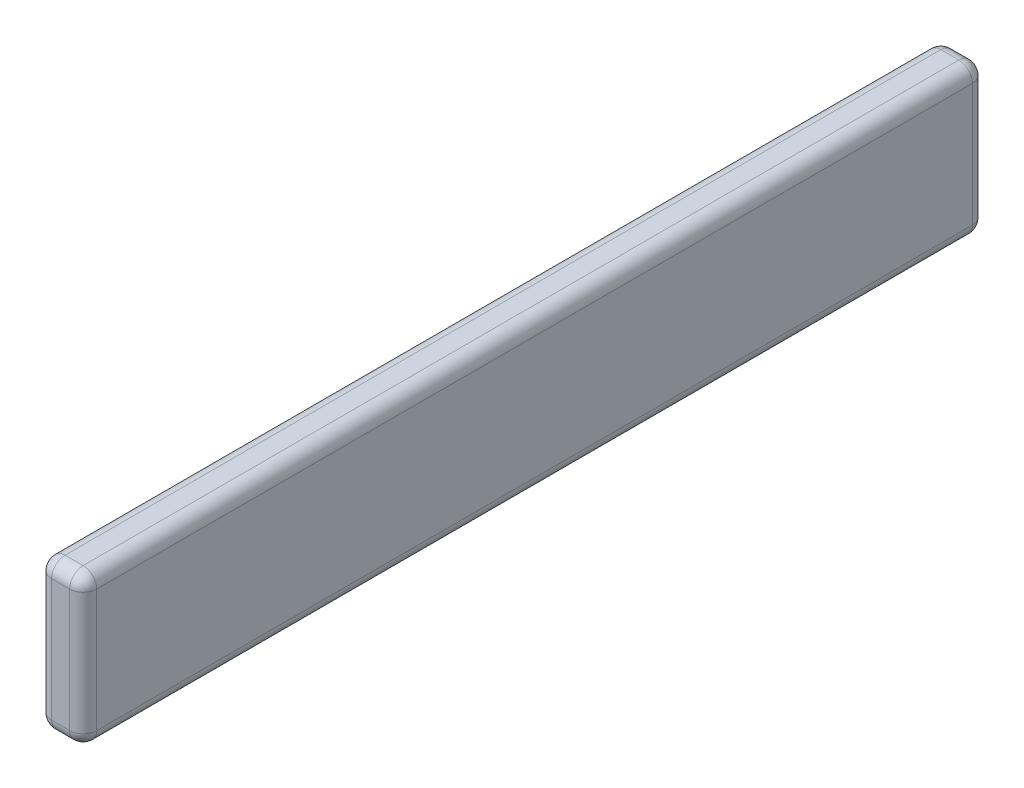
ISO-10303-21;
HEADER;
FILE_DESCRIPTION(('STEP AP214'),'2;1');
FILE_NAME('part.step','',(''),(''),'','','');
FILE_SCHEMA(('AUTOMOTIVE_DESIGN { 1 0 10303 214 1 1 1 1 }'));
ENDSEC;
DATA;
#1=APPLICATION_CONTEXT('core data for automotive mechanical design processes');
#2=APPLICATION_PROTOCOL_DEFINITION('international standard','automotive_design',2000,#1);
#3=PRODUCT_CONTEXT('',#1,'mechanical');
#4=PRODUCT('Part','Part','',(#3));
#5=PRODUCT_RELATED_PRODUCT_CATEGORY('part','',(#4));
#6=PRODUCT_DEFINITION_FORMATION('','',#4);
#7=PRODUCT_DEFINITION_CONTEXT('part definition',#1,'design');
#8=PRODUCT_DEFINITION('design','',#6,#7);
#9=PRODUCT_DEFINITION_SHAPE('','',#8);
#10=(LENGTH_UNIT() NAMED_UNIT(*) SI_UNIT(.MILLI.,.METRE.));
#11=(NAMED_UNIT(*) PLANE_ANGLE_UNIT() SI_UNIT($,.RADIAN.));
#12=(NAMED_UNIT(*) SI_UNIT($,.STERADIAN.) SOLID_ANGLE_UNIT());
#13=UNCERTAINTY_MEASURE_WITH_UNIT(LENGTH_MEASURE(1.E-05),#10,'distance_accuracy_value','');
#14=(GEOMETRIC_REPRESENTATION_CONTEXT(3) GLOBAL_UNCERTAINTY_ASSIGNED_CONTEXT((#13)) GLOBAL_UNIT_ASSIGNED_CONTEXT((#10,
#11,#12)) REPRESENTATION_CONTEXT('',''));
#15=CARTESIAN_POINT('',(0.,0.,0.));
#16=DIRECTION('',(0.,0.,1.));
#17=DIRECTION('',(1.,0.,0.));
#18=AXIS2_PLACEMENT_3D('',#15,#16,#17);
#19=CARTESIAN_POINT('',(100.,165.8,1000.));
#20=DIRECTION('',(0.,0.,-1.));
#21=DIRECTION('',(-1.,0.,0.));
#22=AXIS2_PLACEMENT_3D('',#19,#20,#21);
#23=PLANE('',#22);
#24=DIRECTION('',(-1.,0.,0.));
#25=VECTOR('',#24,1.);
#26=CARTESIAN_POINT('',(100.,135.8,1000.));
#27=LINE('',#26,#25);
#28=CARTESIAN_POINT('',(70.,135.8,1000.));
#29=VERTEX_POINT('',#28);
#30=CARTESIAN_POINT('',(30.,135.8,1000.));
#31=VERTEX_POINT('',#30);
#32=EDGE_CURVE('E181',#29,#31,#27,.T.);
#33=ORIENTED_EDGE('',*,*,#32,.T.);
#34=DIRECTION('',(0.,-1.,0.));
#35=VECTOR('',#34,1.);
#36=CARTESIAN_POINT('',(30.,-165.8,1000.));
#37=LINE('',#36,#35);
#38=CARTESIAN_POINT('',(30.,-135.8,1000.));
#39=VERTEX_POINT('',#38);
#40=EDGE_CURVE('E188',#31,#39,#37,.T.);
#41=ORIENTED_EDGE('',*,*,#40,.T.);
#42=DIRECTION('',(-1.,0.,0.));
#43=VECTOR('',#42,1.);
#44=CARTESIAN_POINT('',(100.,-135.8,1000.));
#45=LINE('',#44,#43);
#46=CARTESIAN_POINT('',(70.,-135.8,1000.));
#47=VERTEX_POINT('',#46);
#48=EDGE_CURVE('E184',#39,#47,#45,.F.);
#49=ORIENTED_EDGE('',*,*,#48,.T.);
#50=DIRECTION('',(0.,-1.,0.));
#51=VECTOR('',#50,1.);
#52=CARTESIAN_POINT('',(70.,165.8,1000.));
#53=LINE('',#52,#51);
#54=EDGE_CURVE('E178',#47,#29,#53,.F.);
#55=ORIENTED_EDGE('',*,*,#54,.T.);
#56=EDGE_LOOP('',(#33,#41,#49,#55));
#57=FACE_BOUND('',#56,.T.);
#58=ADVANCED_FACE('F39',(#57),#23,.F.);
#59=CARTESIAN_POINT('',(100.,-165.8,-1000.));
#60=DIRECTION('',(0.,1.,0.));
#61=DIRECTION('',(0.,0.,1.));
#62=AXIS2_PLACEMENT_3D('',#59,#60,#61);
#63=PLANE('',#62);
#64=DIRECTION('',(-1.,0.,0.));
#65=VECTOR('',#64,1.);
#66=CARTESIAN_POINT('',(100.,-165.8,970.));
#67=LINE('',#66,#65);
#68=CARTESIAN_POINT('',(70.,-165.8,970.));
#69=VERTEX_POINT('',#68);
#70=CARTESIAN_POINT('',(30.,-165.8,970.));
#71=VERTEX_POINT('',#70);
#72=EDGE_CURVE('E140',#69,#71,#67,.T.);
#73=ORIENTED_EDGE('',*,*,#72,.T.);
#74=DIRECTION('',(0.,0.,-1.));
#75=VECTOR('',#74,1.);
#76=CARTESIAN_POINT('',(30.,-165.8,-1000.));
#77=LINE('',#76,#75);
#78=CARTESIAN_POINT('',(30.,-165.8,-970.));
#79=VERTEX_POINT('',#78);
#80=EDGE_CURVE('E135',#71,#79,#77,.T.);
#81=ORIENTED_EDGE('',*,*,#80,.T.);
#82=DIRECTION('',(-1.,0.,0.));
#83=VECTOR('',#82,1.);
#84=CARTESIAN_POINT('',(100.,-165.8,-970.));
#85=LINE('',#84,#83);
#86=CARTESIAN_POINT('',(70.,-165.8,-970.));
#87=VERTEX_POINT('',#86);
#88=EDGE_CURVE('E127',#79,#87,#85,.F.);
#89=ORIENTED_EDGE('',*,*,#88,.T.);
#90=DIRECTION('',(0.,0.,-1.));
#91=VECTOR('',#90,1.);
#92=CARTESIAN_POINT('',(70.,-165.8,-1000.));
#93=LINE('',#92,#91);
#94=EDGE_CURVE('E132',#87,#69,#93,.F.);
#95=ORIENTED_EDGE('',*,*,#94,.T.);
#96=EDGE_LOOP('',(#73,#81,#89,#95));
#97=FACE_BOUND('',#96,.T.);
#98=ADVANCED_FACE('F130',(#97),#63,.F.);
#99=CARTESIAN_POINT('',(100.,165.8,-1000.));
#100=DIRECTION('',(0.,0.,1.));
#101=DIRECTION('',(1.,0.,0.));
#102=AXIS2_PLACEMENT_3D('',#99,#100,#101);
#103=PLANE('',#102);
#104=DIRECTION('',(-1.,0.,0.));
#105=VECTOR('',#104,1.);
#106=CARTESIAN_POINT('',(100.,-135.8,-1000.));
#107=LINE('',#106,#105);
#108=CARTESIAN_POINT('',(70.,-135.8,-1000.));
#109=VERTEX_POINT('',#108);
#110=CARTESIAN_POINT('',(30.,-135.8,-1000.));
#111=VERTEX_POINT('',#110);
#112=EDGE_CURVE('E148',#109,#111,#107,.T.);
#113=ORIENTED_EDGE('',*,*,#112,.T.);
#114=DIRECTION('',(0.,1.,0.));
#115=VECTOR('',#114,1.);
#116=CARTESIAN_POINT('',(30.,165.8,-1000.));
#117=LINE('',#116,#115);
#118=CARTESIAN_POINT('',(30.,135.8,-1000.));
#119=VERTEX_POINT('',#118);
#120=EDGE_CURVE('E199',#111,#119,#117,.T.);
#121=ORIENTED_EDGE('',*,*,#120,.T.);
#122=DIRECTION('',(-1.,0.,0.));
#123=VECTOR('',#122,1.);
#124=CARTESIAN_POINT('',(100.,135.8,-1000.));
#125=LINE('',#124,#123);
#126=CARTESIAN_POINT('',(70.,135.8,-1000.));
#127=VERTEX_POINT('',#126);
#128=EDGE_CURVE('E194',#119,#127,#125,.F.);
#129=ORIENTED_EDGE('',*,*,#128,.T.);
#130=DIRECTION('',(0.,1.,0.));
#131=VECTOR('',#130,1.);
#132=CARTESIAN_POINT('',(70.,165.8,-1000.));
#133=LINE('',#132,#131);
#134=EDGE_CURVE('E191',#127,#109,#133,.F.);
#135=ORIENTED_EDGE('',*,*,#134,.T.);
#136=EDGE_LOOP('',(#113,#121,#129,#135));
#137=FACE_BOUND('',#136,.T.);
#138=ADVANCED_FACE('F378',(#137),#103,.F.);
#139=CARTESIAN_POINT('',(100.,165.8,-1000.));
#140=DIRECTION('',(0.,-1.,0.));
#141=DIRECTION('',(0.,0.,-1.));
#142=AXIS2_PLACEMENT_3D('',#139,#140,#141);
#143=PLANE('',#142);
#144=DIRECTION('',(-1.,0.,0.));
#145=VECTOR('',#144,1.);
#146=CARTESIAN_POINT('',(100.,165.8,-970.));
#147=LINE('',#146,#145);
#148=CARTESIAN_POINT('',(70.,165.8,-970.));
#149=VERTEX_POINT('',#148);
#150=CARTESIAN_POINT('',(30.,165.8,-970.));
#151=VERTEX_POINT('',#150);
#152=EDGE_CURVE('E208',#149,#151,#147,.T.);
#153=ORIENTED_EDGE('',*,*,#152,.T.);
#154=DIRECTION('',(0.,0.,1.));
#155=VECTOR('',#154,1.);
#156=CARTESIAN_POINT('',(30.,165.8,1000.));
#157=LINE('',#156,#155);
#158=CARTESIAN_POINT('',(30.,165.8,970.));
#159=VERTEX_POINT('',#158);
#160=EDGE_CURVE('E212',#151,#159,#157,.T.);
#161=ORIENTED_EDGE('',*,*,#160,.T.);
#162=DIRECTION('',(-1.,0.,0.));
#163=VECTOR('',#162,1.);
#164=CARTESIAN_POINT('',(100.,165.8,970.));
#165=LINE('',#164,#163);
#166=CARTESIAN_POINT('',(70.,165.8,970.));
#167=VERTEX_POINT('',#166);
#168=EDGE_CURVE('E205',#159,#167,#165,.F.);
#169=ORIENTED_EDGE('',*,*,#168,.T.);
#170=DIRECTION('',(0.,0.,1.));
#171=VECTOR('',#170,1.);
#172=CARTESIAN_POINT('',(70.,165.8,-1000.));
#173=LINE('',#172,#171);
#174=EDGE_CURVE('E202',#167,#149,#173,.F.);
#175=ORIENTED_EDGE('',*,*,#174,.T.);
#176=EDGE_LOOP('',(#153,#161,#169,#175));
#177=FACE_BOUND('',#176,.T.);
#178=ADVANCED_FACE('F327',(#177),#143,.F.);
#179=CARTESIAN_POINT('',(100.,0.,0.));
#180=DIRECTION('',(-1.,0.,0.));
#181=DIRECTION('',(0.,0.,1.));
#182=AXIS2_PLACEMENT_3D('',#179,#180,#181);
#183=PLANE('',#182);
#184=DIRECTION('',(0.,1.,0.));
#185=VECTOR('',#184,1.);
#186=CARTESIAN_POINT('',(100.,0.,-970.));
#187=LINE('',#186,#185);
#188=CARTESIAN_POINT('',(100.,-135.8,-970.));
#189=VERTEX_POINT('',#188);
#190=CARTESIAN_POINT('',(100.,135.8,-970.));
#191=VERTEX_POINT('',#190);
#192=EDGE_CURVE('E49',#189,#191,#187,.T.);
#193=ORIENTED_EDGE('',*,*,#192,.T.);
#194=DIRECTION('',(0.,0.,1.));
#195=VECTOR('',#194,1.);
#196=CARTESIAN_POINT('',(100.,135.8,0.));
#197=LINE('',#196,#195);
#198=CARTESIAN_POINT('',(100.,135.8,970.));
#199=VERTEX_POINT('',#198);
#200=EDGE_CURVE('E11',#191,#199,#197,.T.);
#201=ORIENTED_EDGE('',*,*,#200,.T.);
#202=DIRECTION('',(0.,-1.,0.));
#203=VECTOR('',#202,1.);
#204=CARTESIAN_POINT('',(100.,0.,970.));
#205=LINE('',#204,#203);
#206=CARTESIAN_POINT('',(100.,-135.8,970.));
#207=VERTEX_POINT('',#206);
#208=EDGE_CURVE('E228',#199,#207,#205,.T.);
#209=ORIENTED_EDGE('',*,*,#208,.T.);
#210=DIRECTION('',(0.,0.,-1.));
#211=VECTOR('',#210,1.);
#212=CARTESIAN_POINT('',(100.,-135.8,0.));
#213=LINE('',#212,#211);
#214=EDGE_CURVE('E60',#207,#189,#213,.T.);
#215=ORIENTED_EDGE('',*,*,#214,.T.);
#216=EDGE_LOOP('',(#193,#201,#209,#215));
#217=FACE_BOUND('',#216,.T.);
#218=ADVANCED_FACE('F342',(#217),#183,.F.);
#219=CARTESIAN_POINT('',(0.,0.,0.));
#220=DIRECTION('',(-1.,0.,0.));
#221=DIRECTION('',(0.,0.,1.));
#222=AXIS2_PLACEMENT_3D('',#219,#220,#221);
#223=PLANE('',#222);
#224=DIRECTION('',(0.,1.,0.));
#225=VECTOR('',#224,1.);
#226=CARTESIAN_POINT('',(0.,-165.8,-970.));
#227=LINE('',#226,#225);
#228=CARTESIAN_POINT('',(0.,135.8,-970.));
#229=VERTEX_POINT('',#228);
#230=CARTESIAN_POINT('',(0.,-135.8,-970.));
#231=VERTEX_POINT('',#230);
#232=EDGE_CURVE('E221',#229,#231,#227,.F.);
#233=ORIENTED_EDGE('',*,*,#232,.T.);
#234=DIRECTION('',(0.,0.,-1.));
#235=VECTOR('',#234,1.);
#236=CARTESIAN_POINT('',(0.,-135.8,1000.));
#237=LINE('',#236,#235);
#238=CARTESIAN_POINT('',(0.,-135.8,970.));
#239=VERTEX_POINT('',#238);
#240=EDGE_CURVE('E224',#231,#239,#237,.F.);
#241=ORIENTED_EDGE('',*,*,#240,.T.);
#242=DIRECTION('',(0.,-1.,0.));
#243=VECTOR('',#242,1.);
#244=CARTESIAN_POINT('',(0.,165.8,970.));
#245=LINE('',#244,#243);
#246=CARTESIAN_POINT('',(0.,135.8,970.));
#247=VERTEX_POINT('',#246);
#248=EDGE_CURVE('E215',#239,#247,#245,.F.);
#249=ORIENTED_EDGE('',*,*,#248,.T.);
#250=DIRECTION('',(0.,0.,1.));
#251=VECTOR('',#250,1.);
#252=CARTESIAN_POINT('',(0.,135.8,-1000.));
#253=LINE('',#252,#251);
#254=EDGE_CURVE('E218',#247,#229,#253,.F.);
#255=ORIENTED_EDGE('',*,*,#254,.T.);
#256=EDGE_LOOP('',(#233,#241,#249,#255));
#257=FACE_BOUND('',#256,.T.);
#258=ADVANCED_FACE('F318',(#257),#223,.T.);
#259=CARTESIAN_POINT('',(100.,135.8,-970.));
#260=DIRECTION('',(-1.,0.,0.));
#261=DIRECTION('',(0.,0.,1.));
#262=AXIS2_PLACEMENT_3D('',#259,#260,#261);
#263=CYLINDRICAL_SURFACE('',#262,30.);
#264=CARTESIAN_POINT('',(70.,135.8,-970.));
#265=DIRECTION('',(1.,0.,0.));
#266=DIRECTION('',(0.,0.,-1.));
#267=AXIS2_PLACEMENT_3D('',#264,#265,#266);
#268=CIRCLE('',#267,30.);
#269=EDGE_CURVE('E43',#127,#149,#268,.T.);
#270=ORIENTED_EDGE('',*,*,#269,.F.);
#271=ORIENTED_EDGE('',*,*,#128,.F.);
#272=CARTESIAN_POINT('',(30.,135.8,-970.));
#273=DIRECTION('',(-1.,0.,0.));
#274=DIRECTION('',(0.,0.,1.));
#275=AXIS2_PLACEMENT_3D('',#272,#273,#274);
#276=CIRCLE('',#275,30.);
#277=EDGE_CURVE('E172',#151,#119,#276,.T.);
#278=ORIENTED_EDGE('',*,*,#277,.F.);
#279=ORIENTED_EDGE('',*,*,#152,.F.);
#280=EDGE_LOOP('',(#270,#271,#278,#279));
#281=FACE_BOUND('',#280,.T.);
#282=ADVANCED_FACE('F41',(#281),#263,.T.);
#283=CARTESIAN_POINT('',(70.,135.8,-970.));
#284=DIRECTION('',(0.,0.,1.));
#285=DIRECTION('',(1.,0.,0.));
#286=AXIS2_PLACEMENT_3D('',#283,#284,#285);
#287=SPHERICAL_SURFACE('',#286,30.);
#288=CARTESIAN_POINT('',(70.,135.8,-970.));
#289=DIRECTION('',(0.,1.,0.));
#290=DIRECTION('',(0.,0.,1.));
#291=AXIS2_PLACEMENT_3D('',#288,#289,#290);
#292=CIRCLE('',#291,30.);
#293=EDGE_CURVE('E295',#127,#191,#292,.F.);
#294=ORIENTED_EDGE('',*,*,#293,.F.);
#295=ORIENTED_EDGE('',*,*,#269,.T.);
#296=CARTESIAN_POINT('',(70.,135.8,-970.));
#297=DIRECTION('',(0.,0.,-1.));
#298=DIRECTION('',(-1.,0.,0.));
#299=AXIS2_PLACEMENT_3D('',#296,#297,#298);
#300=CIRCLE('',#299,30.);
#301=EDGE_CURVE('E298',#191,#149,#300,.F.);
#302=ORIENTED_EDGE('',*,*,#301,.F.);
#303=EDGE_LOOP('',(#294,#295,#302));
#304=FACE_BOUND('',#303,.T.);
#305=ADVANCED_FACE('F511',(#304),#287,.T.);
#306=CARTESIAN_POINT('',(30.,135.8,-970.));
#307=DIRECTION('',(0.,0.,1.));
#308=DIRECTION('',(1.,0.,0.));
#309=AXIS2_PLACEMENT_3D('',#306,#307,#308);
#310=SPHERICAL_SURFACE('',#309,30.);
#311=CARTESIAN_POINT('',(30.,135.8,-970.));
#312=DIRECTION('',(0.,0.,-1.));
#313=DIRECTION('',(-1.,0.,0.));
#314=AXIS2_PLACEMENT_3D('',#311,#312,#313);
#315=CIRCLE('',#314,30.);
#316=EDGE_CURVE('E287',#151,#229,#315,.F.);
#317=ORIENTED_EDGE('',*,*,#316,.F.);
#318=ORIENTED_EDGE('',*,*,#277,.T.);
#319=CARTESIAN_POINT('',(30.,135.8,-970.));
#320=DIRECTION('',(0.,1.,0.));
#321=DIRECTION('',(0.,0.,1.));
#322=AXIS2_PLACEMENT_3D('',#319,#320,#321);
#323=CIRCLE('',#322,30.);
#324=EDGE_CURVE('E291',#229,#119,#323,.F.);
#325=ORIENTED_EDGE('',*,*,#324,.F.);
#326=EDGE_LOOP('',(#317,#318,#325));
#327=FACE_BOUND('',#326,.T.);
#328=ADVANCED_FACE('F307',(#327),#310,.T.);
#329=CARTESIAN_POINT('',(70.,135.8,0.));
#330=DIRECTION('',(0.,0.,1.));
#331=DIRECTION('',(0.,-1.,0.));
#332=AXIS2_PLACEMENT_3D('',#329,#330,#331);
#333=CYLINDRICAL_SURFACE('',#332,30.);
#334=ORIENTED_EDGE('',*,*,#301,.T.);
#335=ORIENTED_EDGE('',*,*,#174,.F.);
#336=CARTESIAN_POINT('',(70.,135.8,970.));
#337=DIRECTION('',(0.,0.,1.));
#338=DIRECTION('',(1.,0.,0.));
#339=AXIS2_PLACEMENT_3D('',#336,#337,#338);
#340=CIRCLE('',#339,30.);
#341=EDGE_CURVE('E279',#199,#167,#340,.T.);
#342=ORIENTED_EDGE('',*,*,#341,.F.);
#343=ORIENTED_EDGE('',*,*,#200,.F.);
#344=EDGE_LOOP('',(#334,#335,#342,#343));
#345=FACE_BOUND('',#344,.T.);
#346=ADVANCED_FACE('F341',(#345),#333,.T.);
#347=CARTESIAN_POINT('',(70.,0.,-970.));
#348=DIRECTION('',(0.,1.,0.));
#349=DIRECTION('',(0.,0.,1.));
#350=AXIS2_PLACEMENT_3D('',#347,#348,#349);
#351=CYLINDRICAL_SURFACE('',#350,30.);
#352=ORIENTED_EDGE('',*,*,#293,.T.);
#353=ORIENTED_EDGE('',*,*,#192,.F.);
#354=CARTESIAN_POINT('',(70.,-135.8,-970.));
#355=DIRECTION('',(0.,-1.,0.));
#356=DIRECTION('',(1.,0.,0.));
#357=AXIS2_PLACEMENT_3D('',#354,#355,#356);
#358=CIRCLE('',#357,30.);
#359=EDGE_CURVE('E153',#109,#189,#358,.T.);
#360=ORIENTED_EDGE('',*,*,#359,.F.);
#361=ORIENTED_EDGE('',*,*,#134,.F.);
#362=EDGE_LOOP('',(#352,#353,#360,#361));
#363=FACE_BOUND('',#362,.T.);
#364=ADVANCED_FACE('F488',(#363),#351,.T.);
#365=CARTESIAN_POINT('',(100.,-135.8,-970.));
#366=DIRECTION('',(-1.,0.,0.));
#367=DIRECTION('',(0.,0.,1.));
#368=AXIS2_PLACEMENT_3D('',#365,#366,#367);
#369=CYLINDRICAL_SURFACE('',#368,30.);
#370=CARTESIAN_POINT('',(30.,-135.8,-970.));
#371=DIRECTION('',(-1.,0.,0.));
#372=DIRECTION('',(0.,0.,1.));
#373=AXIS2_PLACEMENT_3D('',#370,#371,#372);
#374=CIRCLE('',#373,30.);
#375=EDGE_CURVE('E154',#111,#79,#374,.T.);
#376=ORIENTED_EDGE('',*,*,#375,.F.);
#377=ORIENTED_EDGE('',*,*,#112,.F.);
#378=CARTESIAN_POINT('',(70.,-135.8,-970.));
#379=DIRECTION('',(1.,0.,0.));
#380=DIRECTION('',(0.,0.,-1.));
#381=AXIS2_PLACEMENT_3D('',#378,#379,#380);
#382=CIRCLE('',#381,30.);
#383=EDGE_CURVE('E144',#87,#109,#382,.T.);
#384=ORIENTED_EDGE('',*,*,#383,.F.);
#385=ORIENTED_EDGE('',*,*,#88,.F.);
#386=EDGE_LOOP('',(#376,#377,#384,#385));
#387=FACE_BOUND('',#386,.T.);
#388=ADVANCED_FACE('F146',(#387),#369,.T.);
#389=CARTESIAN_POINT('',(30.,165.8,-970.));
#390=DIRECTION('',(0.,-1.,0.));
#391=DIRECTION('',(0.,0.,-1.));
#392=AXIS2_PLACEMENT_3D('',#389,#390,#391);
#393=CYLINDRICAL_SURFACE('',#392,30.);
#394=ORIENTED_EDGE('',*,*,#324,.T.);
#395=ORIENTED_EDGE('',*,*,#120,.F.);
#396=CARTESIAN_POINT('',(30.,-135.8,-970.));
#397=DIRECTION('',(0.,-1.,0.));
#398=DIRECTION('',(0.,0.,-1.));
#399=AXIS2_PLACEMENT_3D('',#396,#397,#398);
#400=CIRCLE('',#399,30.);
#401=EDGE_CURVE('E272',#231,#111,#400,.T.);
#402=ORIENTED_EDGE('',*,*,#401,.F.);
#403=ORIENTED_EDGE('',*,*,#232,.F.);
#404=EDGE_LOOP('',(#394,#395,#402,#403));
#405=FACE_BOUND('',#404,.T.);
#406=ADVANCED_FACE('F314',(#405),#393,.T.);
#407=CARTESIAN_POINT('',(30.,135.8,-1000.));
#408=DIRECTION('',(0.,0.,-1.));
#409=DIRECTION('',(0.,1.,0.));
#410=AXIS2_PLACEMENT_3D('',#407,#408,#409);
#411=CYLINDRICAL_SURFACE('',#410,30.);
#412=ORIENTED_EDGE('',*,*,#316,.T.);
#413=ORIENTED_EDGE('',*,*,#254,.F.);
#414=CARTESIAN_POINT('',(30.,135.8,970.));
#415=DIRECTION('',(0.,0.,1.));
#416=DIRECTION('',(1.,0.,0.));
#417=AXIS2_PLACEMENT_3D('',#414,#415,#416);
#418=CIRCLE('',#417,30.);
#419=EDGE_CURVE('E268',#159,#247,#418,.T.);
#420=ORIENTED_EDGE('',*,*,#419,.F.);
#421=ORIENTED_EDGE('',*,*,#160,.F.);
#422=EDGE_LOOP('',(#412,#413,#420,#421));
#423=FACE_BOUND('',#422,.T.);
#424=ADVANCED_FACE('F324',(#423),#411,.T.);
#425=CARTESIAN_POINT('',(100.,135.8,970.));
#426=DIRECTION('',(-1.,0.,0.));
#427=DIRECTION('',(0.,0.,1.));
#428=AXIS2_PLACEMENT_3D('',#425,#426,#427);
#429=CYLINDRICAL_SURFACE('',#428,30.);
#430=CARTESIAN_POINT('',(70.,135.8,970.));
#431=DIRECTION('',(1.,0.,0.));
#432=DIRECTION('',(0.,0.,-1.));
#433=AXIS2_PLACEMENT_3D('',#430,#431,#432);
#434=CIRCLE('',#433,30.);
#435=EDGE_CURVE('E283',#167,#29,#434,.T.);
#436=ORIENTED_EDGE('',*,*,#435,.F.);
#437=ORIENTED_EDGE('',*,*,#168,.F.);
#438=CARTESIAN_POINT('',(30.,135.8,970.));
#439=DIRECTION('',(-1.,0.,0.));
#440=DIRECTION('',(0.,0.,1.));
#441=AXIS2_PLACEMENT_3D('',#438,#439,#440);
#442=CIRCLE('',#441,30.);
#443=EDGE_CURVE('E264',#31,#159,#442,.T.);
#444=ORIENTED_EDGE('',*,*,#443,.F.);
#445=ORIENTED_EDGE('',*,*,#32,.F.);
#446=EDGE_LOOP('',(#436,#437,#444,#445));
#447=FACE_BOUND('',#446,.T.);
#448=ADVANCED_FACE('F332',(#447),#429,.T.);
#449=CARTESIAN_POINT('',(70.,135.8,970.));
#450=DIRECTION('',(0.,0.,1.));
#451=DIRECTION('',(1.,0.,0.));
#452=AXIS2_PLACEMENT_3D('',#449,#450,#451);
#453=SPHERICAL_SURFACE('',#452,30.);
#454=ORIENTED_EDGE('',*,*,#341,.T.);
#455=ORIENTED_EDGE('',*,*,#435,.T.);
#456=CARTESIAN_POINT('',(70.,135.8,970.));
#457=DIRECTION('',(0.,1.,0.));
#458=DIRECTION('',(0.,0.,1.));
#459=AXIS2_PLACEMENT_3D('',#456,#457,#458);
#460=CIRCLE('',#459,30.);
#461=EDGE_CURVE('E161',#199,#29,#460,.F.);
#462=ORIENTED_EDGE('',*,*,#461,.F.);
#463=EDGE_LOOP('',(#454,#455,#462));
#464=FACE_BOUND('',#463,.T.);
#465=ADVANCED_FACE('F338',(#464),#453,.T.);
#466=CARTESIAN_POINT('',(70.,-135.8,-970.));
#467=DIRECTION('',(0.,0.,1.));
#468=DIRECTION('',(1.,0.,0.));
#469=AXIS2_PLACEMENT_3D('',#466,#467,#468);
#470=SPHERICAL_SURFACE('',#469,30.);
#471=ORIENTED_EDGE('',*,*,#383,.T.);
#472=ORIENTED_EDGE('',*,*,#359,.T.);
#473=CARTESIAN_POINT('',(70.,-135.8,-970.));
#474=DIRECTION('',(0.,0.,-1.));
#475=DIRECTION('',(-1.,0.,0.));
#476=AXIS2_PLACEMENT_3D('',#473,#474,#475);
#477=CIRCLE('',#476,30.);
#478=EDGE_CURVE('E157',#87,#189,#477,.F.);
#479=ORIENTED_EDGE('',*,*,#478,.F.);
#480=EDGE_LOOP('',(#471,#472,#479));
#481=FACE_BOUND('',#480,.T.);
#482=ADVANCED_FACE('F158',(#481),#470,.T.);
#483=CARTESIAN_POINT('',(30.,-135.8,-970.));
#484=DIRECTION('',(0.,0.,1.));
#485=DIRECTION('',(1.,0.,0.));
#486=AXIS2_PLACEMENT_3D('',#483,#484,#485);
#487=SPHERICAL_SURFACE('',#486,30.);
#488=ORIENTED_EDGE('',*,*,#401,.T.);
#489=ORIENTED_EDGE('',*,*,#375,.T.);
#490=CARTESIAN_POINT('',(30.,-135.8,-970.));
#491=DIRECTION('',(0.,0.,-1.));
#492=DIRECTION('',(-1.,0.,0.));
#493=AXIS2_PLACEMENT_3D('',#490,#491,#492);
#494=CIRCLE('',#493,30.);
#495=EDGE_CURVE('E162',#231,#79,#494,.F.);
#496=ORIENTED_EDGE('',*,*,#495,.F.);
#497=EDGE_LOOP('',(#488,#489,#496));
#498=FACE_BOUND('',#497,.T.);
#499=ADVANCED_FACE('F361',(#498),#487,.T.);
#500=CARTESIAN_POINT('',(30.,135.8,970.));
#501=DIRECTION('',(0.,0.,1.));
#502=DIRECTION('',(1.,0.,0.));
#503=AXIS2_PLACEMENT_3D('',#500,#501,#502);
#504=SPHERICAL_SURFACE('',#503,30.);
#505=ORIENTED_EDGE('',*,*,#443,.T.);
#506=ORIENTED_EDGE('',*,*,#419,.T.);
#507=CARTESIAN_POINT('',(30.,135.8,970.));
#508=DIRECTION('',(0.,1.,0.));
#509=DIRECTION('',(0.,0.,1.));
#510=AXIS2_PLACEMENT_3D('',#507,#508,#509);
#511=CIRCLE('',#510,30.);
#512=EDGE_CURVE('E254',#31,#247,#511,.F.);
#513=ORIENTED_EDGE('',*,*,#512,.F.);
#514=EDGE_LOOP('',(#505,#506,#513));
#515=FACE_BOUND('',#514,.T.);
#516=ADVANCED_FACE('F363',(#515),#504,.T.);
#517=CARTESIAN_POINT('',(70.,0.,970.));
#518=DIRECTION('',(0.,-1.,0.));
#519=DIRECTION('',(0.,0.,-1.));
#520=AXIS2_PLACEMENT_3D('',#517,#518,#519);
#521=CYLINDRICAL_SURFACE('',#520,30.);
#522=ORIENTED_EDGE('',*,*,#461,.T.);
#523=ORIENTED_EDGE('',*,*,#54,.F.);
#524=CARTESIAN_POINT('',(70.,-135.8,970.));
#525=DIRECTION('',(0.,-1.,0.));
#526=DIRECTION('',(0.,0.,-1.));
#527=AXIS2_PLACEMENT_3D('',#524,#525,#526);
#528=CIRCLE('',#527,30.);
#529=EDGE_CURVE('E250',#207,#47,#528,.T.);
#530=ORIENTED_EDGE('',*,*,#529,.F.);
#531=ORIENTED_EDGE('',*,*,#208,.F.);
#532=EDGE_LOOP('',(#522,#523,#530,#531));
#533=FACE_BOUND('',#532,.T.);
#534=ADVANCED_FACE('F346',(#533),#521,.T.);
#535=CARTESIAN_POINT('',(70.,-135.8,0.));
#536=DIRECTION('',(0.,0.,-1.));
#537=DIRECTION('',(0.,1.,0.));
#538=AXIS2_PLACEMENT_3D('',#535,#536,#537);
#539=CYLINDRICAL_SURFACE('',#538,30.);
#540=ORIENTED_EDGE('',*,*,#478,.T.);
#541=ORIENTED_EDGE('',*,*,#214,.F.);
#542=CARTESIAN_POINT('',(70.,-135.8,970.));
#543=DIRECTION('',(0.,0.,1.));
#544=DIRECTION('',(1.,0.,0.));
#545=AXIS2_PLACEMENT_3D('',#542,#543,#544);
#546=CIRCLE('',#545,30.);
#547=EDGE_CURVE('E166',#69,#207,#546,.T.);
#548=ORIENTED_EDGE('',*,*,#547,.F.);
#549=ORIENTED_EDGE('',*,*,#94,.F.);
#550=EDGE_LOOP('',(#540,#541,#548,#549));
#551=FACE_BOUND('',#550,.T.);
#552=ADVANCED_FACE('F164',(#551),#539,.T.);
#553=CARTESIAN_POINT('',(30.,-135.8,-1000.));
#554=DIRECTION('',(0.,0.,1.));
#555=DIRECTION('',(0.,-1.,0.));
#556=AXIS2_PLACEMENT_3D('',#553,#554,#555);
#557=CYLINDRICAL_SURFACE('',#556,30.);
#558=ORIENTED_EDGE('',*,*,#495,.T.);
#559=ORIENTED_EDGE('',*,*,#80,.F.);
#560=CARTESIAN_POINT('',(30.,-135.8,970.));
#561=DIRECTION('',(0.,0.,1.));
#562=DIRECTION('',(0.,-1.,0.));
#563=AXIS2_PLACEMENT_3D('',#560,#561,#562);
#564=CIRCLE('',#563,30.);
#565=EDGE_CURVE('E244',#239,#71,#564,.T.);
#566=ORIENTED_EDGE('',*,*,#565,.F.);
#567=ORIENTED_EDGE('',*,*,#240,.F.);
#568=EDGE_LOOP('',(#558,#559,#566,#567));
#569=FACE_BOUND('',#568,.T.);
#570=ADVANCED_FACE('F359',(#569),#557,.T.);
#571=CARTESIAN_POINT('',(30.,165.8,970.));
#572=DIRECTION('',(0.,1.,0.));
#573=DIRECTION('',(0.,0.,1.));
#574=AXIS2_PLACEMENT_3D('',#571,#572,#573);
#575=CYLINDRICAL_SURFACE('',#574,30.);
#576=ORIENTED_EDGE('',*,*,#512,.T.);
#577=ORIENTED_EDGE('',*,*,#248,.F.);
#578=CARTESIAN_POINT('',(30.,-135.8,970.));
#579=DIRECTION('',(0.,-1.,0.));
#580=DIRECTION('',(0.,0.,-1.));
#581=AXIS2_PLACEMENT_3D('',#578,#579,#580);
#582=CIRCLE('',#581,30.);
#583=EDGE_CURVE('E241',#39,#239,#582,.T.);
#584=ORIENTED_EDGE('',*,*,#583,.F.);
#585=ORIENTED_EDGE('',*,*,#40,.F.);
#586=EDGE_LOOP('',(#576,#577,#584,#585));
#587=FACE_BOUND('',#586,.T.);
#588=ADVANCED_FACE('F388',(#587),#575,.T.);
#589=CARTESIAN_POINT('',(70.,-135.8,970.));
#590=DIRECTION('',(0.,0.,1.));
#591=DIRECTION('',(1.,0.,0.));
#592=AXIS2_PLACEMENT_3D('',#589,#590,#591);
#593=SPHERICAL_SURFACE('',#592,30.);
#594=ORIENTED_EDGE('',*,*,#547,.T.);
#595=ORIENTED_EDGE('',*,*,#529,.T.);
#596=CARTESIAN_POINT('',(70.,-135.8,970.));
#597=DIRECTION('',(1.,0.,0.));
#598=DIRECTION('',(0.,0.,-1.));
#599=AXIS2_PLACEMENT_3D('',#596,#597,#598);
#600=CIRCLE('',#599,30.);
#601=EDGE_CURVE('E238',#69,#47,#600,.F.);
#602=ORIENTED_EDGE('',*,*,#601,.F.);
#603=EDGE_LOOP('',(#594,#595,#602));
#604=FACE_BOUND('',#603,.T.);
#605=ADVANCED_FACE('F348',(#604),#593,.T.);
#606=CARTESIAN_POINT('',(30.,-135.8,970.));
#607=DIRECTION('',(0.,0.,1.));
#608=DIRECTION('',(1.,0.,0.));
#609=AXIS2_PLACEMENT_3D('',#606,#607,#608);
#610=SPHERICAL_SURFACE('',#609,30.);
#611=ORIENTED_EDGE('',*,*,#583,.T.);
#612=ORIENTED_EDGE('',*,*,#565,.T.);
#613=CARTESIAN_POINT('',(30.,-135.8,970.));
#614=DIRECTION('',(-1.,0.,0.));
#615=DIRECTION('',(0.,0.,1.));
#616=AXIS2_PLACEMENT_3D('',#613,#614,#615);
#617=CIRCLE('',#616,30.);
#618=EDGE_CURVE('E235',#39,#71,#617,.F.);
#619=ORIENTED_EDGE('',*,*,#618,.F.);
#620=EDGE_LOOP('',(#611,#612,#619));
#621=FACE_BOUND('',#620,.T.);
#622=ADVANCED_FACE('F356',(#621),#610,.T.);
#623=CARTESIAN_POINT('',(100.,-135.8,970.));
#624=DIRECTION('',(-1.,0.,0.));
#625=DIRECTION('',(0.,0.,1.));
#626=AXIS2_PLACEMENT_3D('',#623,#624,#625);
#627=CYLINDRICAL_SURFACE('',#626,30.);
#628=ORIENTED_EDGE('',*,*,#601,.T.);
#629=ORIENTED_EDGE('',*,*,#48,.F.);
#630=ORIENTED_EDGE('',*,*,#618,.T.);
#631=ORIENTED_EDGE('',*,*,#72,.F.);
#632=EDGE_LOOP('',(#628,#629,#630,#631));
#633=FACE_BOUND('',#632,.T.);
#634=ADVANCED_FACE('F352',(#633),#627,.T.);
#635=CLOSED_SHELL('',(#58,#98,#138,#178,#218,#258,#282,#305,#328,#346,#364,#388,#406,#424,#448,
#465,#482,#499,#516,#534,#552,#570,#588,#605,#622,#634));
#636=MANIFOLD_SOLID_BREP('B2',#635);
#637=ADVANCED_BREP_SHAPE_REPRESENTATION('',(#18,#636),#14);
#638=SHAPE_DEFINITION_REPRESENTATION(#9,#637);
ENDSEC;
END-ISO-10303-21;
